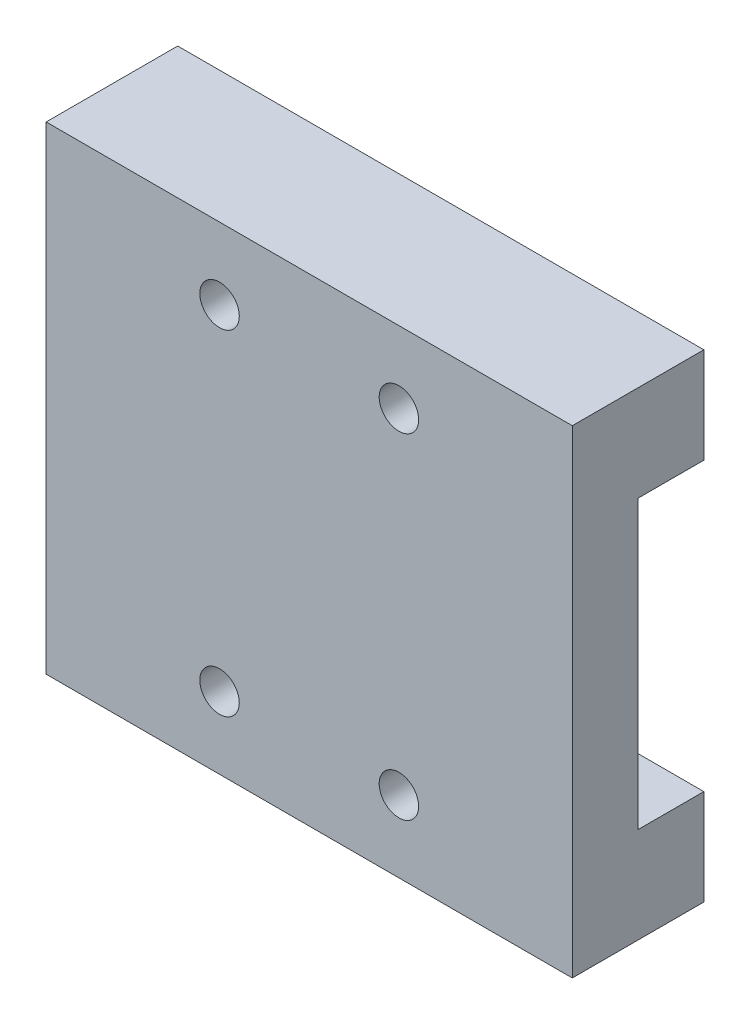
ISO-10303-21;
HEADER;
FILE_DESCRIPTION(('STEP AP214'),'2;1');
FILE_NAME('part.step','',(''),(''),'','','');
FILE_SCHEMA(('AUTOMOTIVE_DESIGN { 1 0 10303 214 1 1 1 1 }'));
ENDSEC;
DATA;
#1=APPLICATION_CONTEXT('core data for automotive mechanical design processes');
#2=APPLICATION_PROTOCOL_DEFINITION('international standard','automotive_design',2000,#1);
#3=PRODUCT_CONTEXT('',#1,'mechanical');
#4=PRODUCT('Part','Part','',(#3));
#5=PRODUCT_RELATED_PRODUCT_CATEGORY('part','',(#4));
#6=PRODUCT_DEFINITION_FORMATION('','',#4);
#7=PRODUCT_DEFINITION_CONTEXT('part definition',#1,'design');
#8=PRODUCT_DEFINITION('design','',#6,#7);
#9=PRODUCT_DEFINITION_SHAPE('','',#8);
#10=(LENGTH_UNIT() NAMED_UNIT(*) SI_UNIT(.MILLI.,.METRE.));
#11=(NAMED_UNIT(*) PLANE_ANGLE_UNIT() SI_UNIT($,.RADIAN.));
#12=(NAMED_UNIT(*) SI_UNIT($,.STERADIAN.) SOLID_ANGLE_UNIT());
#13=UNCERTAINTY_MEASURE_WITH_UNIT(LENGTH_MEASURE(1.E-05),#10,'distance_accuracy_value','');
#14=(GEOMETRIC_REPRESENTATION_CONTEXT(3) GLOBAL_UNCERTAINTY_ASSIGNED_CONTEXT((#13)) GLOBAL_UNIT_ASSIGNED_CONTEXT((#10,
#11,#12)) REPRESENTATION_CONTEXT('',''));
#15=CARTESIAN_POINT('',(0.,0.,0.));
#16=DIRECTION('',(0.,0.,1.));
#17=DIRECTION('',(1.,0.,0.));
#18=AXIS2_PLACEMENT_3D('',#15,#16,#17);
#19=CARTESIAN_POINT('',(0.,40.,0.));
#20=DIRECTION('',(0.,0.,-1.));
#21=DIRECTION('',(-1.,0.,0.));
#22=AXIS2_PLACEMENT_3D('',#19,#20,#21);
#23=PLANE('',#22);
#24=CARTESIAN_POINT('',(14.5,34.,0.));
#25=DIRECTION('',(0.,0.,-1.));
#26=DIRECTION('',(-1.,0.,0.));
#27=AXIS2_PLACEMENT_3D('',#24,#25,#26);
#28=CIRCLE('',#27,0.152148465884537);
#29=CARTESIAN_POINT('',(14.6521484658845,34.,0.));
#30=VERTEX_POINT('',#29);
#31=EDGE_CURVE('E39',#30,#30,#28,.T.);
#32=ORIENTED_EDGE('',*,*,#31,.F.);
#33=EDGE_LOOP('',(#32));
#34=FACE_BOUND('',#33,.T.);
#35=CARTESIAN_POINT('',(29.5,34.,0.));
#36=DIRECTION('',(0.,0.,-1.));
#37=DIRECTION('',(-1.,0.,0.));
#38=AXIS2_PLACEMENT_3D('',#35,#36,#37);
#39=CIRCLE('',#38,0.152148465884537);
#40=CARTESIAN_POINT('',(29.6521484658845,34.,0.));
#41=VERTEX_POINT('',#40);
#42=EDGE_CURVE('E176',#41,#41,#39,.T.);
#43=ORIENTED_EDGE('',*,*,#42,.F.);
#44=EDGE_LOOP('',(#43));
#45=FACE_BOUND('',#44,.T.);
#46=DIRECTION('',(-1.,0.,0.));
#47=VECTOR('',#46,1.);
#48=CARTESIAN_POINT('',(44.,32.,0.));
#49=LINE('',#48,#47);
#50=CARTESIAN_POINT('',(44.,32.,0.));
#51=VERTEX_POINT('',#50);
#52=CARTESIAN_POINT('',(0.,32.,0.));
#53=VERTEX_POINT('',#52);
#54=EDGE_CURVE('E145',#51,#53,#49,.T.);
#55=ORIENTED_EDGE('',*,*,#54,.T.);
#56=DIRECTION('',(0.,-1.,0.));
#57=VECTOR('',#56,1.);
#58=CARTESIAN_POINT('',(0.,0.,0.));
#59=LINE('',#58,#57);
#60=CARTESIAN_POINT('',(0.,40.,0.));
#61=VERTEX_POINT('',#60);
#62=EDGE_CURVE('E158',#61,#53,#59,.T.);
#63=ORIENTED_EDGE('',*,*,#62,.F.);
#64=DIRECTION('',(-1.,0.,0.));
#65=VECTOR('',#64,1.);
#66=CARTESIAN_POINT('',(0.,40.,0.));
#67=LINE('',#66,#65);
#68=CARTESIAN_POINT('',(44.,40.,0.));
#69=VERTEX_POINT('',#68);
#70=EDGE_CURVE('E82',#69,#61,#67,.T.);
#71=ORIENTED_EDGE('',*,*,#70,.F.);
#72=DIRECTION('',(0.,1.,0.));
#73=VECTOR('',#72,1.);
#74=CARTESIAN_POINT('',(44.,0.,0.));
#75=LINE('',#74,#73);
#76=EDGE_CURVE('E163',#51,#69,#75,.T.);
#77=ORIENTED_EDGE('',*,*,#76,.F.);
#78=EDGE_LOOP('',(#55,#63,#71,#77));
#79=FACE_BOUND('',#78,.T.);
#80=ADVANCED_FACE('F35',(#34,#45,#79),#23,.T.);
#81=CARTESIAN_POINT('',(0.,0.,11.));
#82=DIRECTION('',(1.,0.,0.));
#83=DIRECTION('',(0.,0.,-1.));
#84=AXIS2_PLACEMENT_3D('',#81,#82,#83);
#85=PLANE('',#84);
#86=ORIENTED_EDGE('',*,*,#62,.T.);
#87=DIRECTION('',(0.,0.,-1.));
#88=VECTOR('',#87,1.);
#89=CARTESIAN_POINT('',(0.,32.,0.));
#90=LINE('',#89,#88);
#91=CARTESIAN_POINT('',(0.,32.,5.5));
#92=VERTEX_POINT('',#91);
#93=EDGE_CURVE('E133',#92,#53,#90,.T.);
#94=ORIENTED_EDGE('',*,*,#93,.F.);
#95=DIRECTION('',(0.,1.,0.));
#96=VECTOR('',#95,1.);
#97=CARTESIAN_POINT('',(0.,8.,5.5));
#98=LINE('',#97,#96);
#99=CARTESIAN_POINT('',(0.,8.,5.5));
#100=VERTEX_POINT('',#99);
#101=EDGE_CURVE('E135',#100,#92,#98,.T.);
#102=ORIENTED_EDGE('',*,*,#101,.F.);
#103=DIRECTION('',(0.,0.,1.));
#104=VECTOR('',#103,1.);
#105=CARTESIAN_POINT('',(0.,8.,0.));
#106=LINE('',#105,#104);
#107=CARTESIAN_POINT('',(0.,8.,0.));
#108=VERTEX_POINT('',#107);
#109=EDGE_CURVE('E113',#108,#100,#106,.T.);
#110=ORIENTED_EDGE('',*,*,#109,.F.);
#111=CARTESIAN_POINT('',(0.,0.,0.));
#112=VERTEX_POINT('',#111);
#113=EDGE_CURVE('E148',#108,#112,#59,.T.);
#114=ORIENTED_EDGE('',*,*,#113,.T.);
#115=DIRECTION('',(0.,0.,-1.));
#116=VECTOR('',#115,1.);
#117=CARTESIAN_POINT('',(0.,0.,11.));
#118=LINE('',#117,#116);
#119=CARTESIAN_POINT('',(0.,0.,11.));
#120=VERTEX_POINT('',#119);
#121=EDGE_CURVE('E11',#120,#112,#118,.T.);
#122=ORIENTED_EDGE('',*,*,#121,.F.);
#123=DIRECTION('',(0.,-1.,0.));
#124=VECTOR('',#123,1.);
#125=CARTESIAN_POINT('',(0.,0.,11.));
#126=LINE('',#125,#124);
#127=CARTESIAN_POINT('',(0.,40.,11.));
#128=VERTEX_POINT('',#127);
#129=EDGE_CURVE('E151',#128,#120,#126,.T.);
#130=ORIENTED_EDGE('',*,*,#129,.F.);
#131=DIRECTION('',(0.,0.,-1.));
#132=VECTOR('',#131,1.);
#133=CARTESIAN_POINT('',(0.,40.,11.));
#134=LINE('',#133,#132);
#135=EDGE_CURVE('E157',#128,#61,#134,.T.);
#136=ORIENTED_EDGE('',*,*,#135,.T.);
#137=EDGE_LOOP('',(#86,#94,#102,#110,#114,#122,#130,#136));
#138=FACE_BOUND('',#137,.T.);
#139=ADVANCED_FACE('F37',(#138),#85,.F.);
#140=CARTESIAN_POINT('',(0.,0.,11.));
#141=DIRECTION('',(0.,1.,0.));
#142=DIRECTION('',(0.,0.,1.));
#143=AXIS2_PLACEMENT_3D('',#140,#141,#142);
#144=PLANE('',#143);
#145=DIRECTION('',(1.,0.,0.));
#146=VECTOR('',#145,1.);
#147=CARTESIAN_POINT('',(0.,0.,0.));
#148=LINE('',#147,#146);
#149=CARTESIAN_POINT('',(44.,0.,0.));
#150=VERTEX_POINT('',#149);
#151=EDGE_CURVE('E161',#112,#150,#148,.T.);
#152=ORIENTED_EDGE('',*,*,#151,.T.);
#153=DIRECTION('',(0.,0.,-1.));
#154=VECTOR('',#153,1.);
#155=CARTESIAN_POINT('',(44.,0.,11.));
#156=LINE('',#155,#154);
#157=CARTESIAN_POINT('',(44.,0.,11.));
#158=VERTEX_POINT('',#157);
#159=EDGE_CURVE('E44',#158,#150,#156,.T.);
#160=ORIENTED_EDGE('',*,*,#159,.F.);
#161=DIRECTION('',(1.,0.,0.));
#162=VECTOR('',#161,1.);
#163=CARTESIAN_POINT('',(0.,0.,11.));
#164=LINE('',#163,#162);
#165=EDGE_CURVE('E89',#120,#158,#164,.T.);
#166=ORIENTED_EDGE('',*,*,#165,.F.);
#167=ORIENTED_EDGE('',*,*,#121,.T.);
#168=EDGE_LOOP('',(#152,#160,#166,#167));
#169=FACE_BOUND('',#168,.T.);
#170=ADVANCED_FACE('F222',(#169),#144,.F.);
#171=CARTESIAN_POINT('',(44.,0.,11.));
#172=DIRECTION('',(-1.,0.,0.));
#173=DIRECTION('',(0.,0.,1.));
#174=AXIS2_PLACEMENT_3D('',#171,#172,#173);
#175=PLANE('',#174);
#176=DIRECTION('',(0.,1.,0.));
#177=VECTOR('',#176,1.);
#178=CARTESIAN_POINT('',(44.,8.,5.5));
#179=LINE('',#178,#177);
#180=CARTESIAN_POINT('',(44.,8.,5.5));
#181=VERTEX_POINT('',#180);
#182=CARTESIAN_POINT('',(44.,32.,5.5));
#183=VERTEX_POINT('',#182);
#184=EDGE_CURVE('E121',#181,#183,#179,.T.);
#185=ORIENTED_EDGE('',*,*,#184,.T.);
#186=DIRECTION('',(0.,0.,-1.));
#187=VECTOR('',#186,1.);
#188=CARTESIAN_POINT('',(44.,32.,0.));
#189=LINE('',#188,#187);
#190=EDGE_CURVE('E126',#183,#51,#189,.T.);
#191=ORIENTED_EDGE('',*,*,#190,.T.);
#192=ORIENTED_EDGE('',*,*,#76,.T.);
#193=DIRECTION('',(0.,0.,-1.));
#194=VECTOR('',#193,1.);
#195=CARTESIAN_POINT('',(44.,40.,11.));
#196=LINE('',#195,#194);
#197=CARTESIAN_POINT('',(44.,40.,11.));
#198=VERTEX_POINT('',#197);
#199=EDGE_CURVE('E167',#198,#69,#196,.T.);
#200=ORIENTED_EDGE('',*,*,#199,.F.);
#201=DIRECTION('',(0.,1.,0.));
#202=VECTOR('',#201,1.);
#203=CARTESIAN_POINT('',(44.,0.,11.));
#204=LINE('',#203,#202);
#205=EDGE_CURVE('E154',#158,#198,#204,.T.);
#206=ORIENTED_EDGE('',*,*,#205,.F.);
#207=ORIENTED_EDGE('',*,*,#159,.T.);
#208=CARTESIAN_POINT('',(44.,8.,0.));
#209=VERTEX_POINT('',#208);
#210=EDGE_CURVE('E132',#150,#209,#75,.T.);
#211=ORIENTED_EDGE('',*,*,#210,.T.);
#212=DIRECTION('',(0.,0.,1.));
#213=VECTOR('',#212,1.);
#214=CARTESIAN_POINT('',(44.,8.,0.));
#215=LINE('',#214,#213);
#216=EDGE_CURVE('E52',#209,#181,#215,.T.);
#217=ORIENTED_EDGE('',*,*,#216,.T.);
#218=EDGE_LOOP('',(#185,#191,#192,#200,#206,#207,#211,#217));
#219=FACE_BOUND('',#218,.T.);
#220=ADVANCED_FACE('F129',(#219),#175,.F.);
#221=CARTESIAN_POINT('',(0.,40.,11.));
#222=DIRECTION('',(0.,-1.,0.));
#223=DIRECTION('',(0.,0.,-1.));
#224=AXIS2_PLACEMENT_3D('',#221,#222,#223);
#225=PLANE('',#224);
#226=ORIENTED_EDGE('',*,*,#70,.T.);
#227=ORIENTED_EDGE('',*,*,#135,.F.);
#228=DIRECTION('',(-1.,0.,0.));
#229=VECTOR('',#228,1.);
#230=CARTESIAN_POINT('',(0.,40.,11.));
#231=LINE('',#230,#229);
#232=EDGE_CURVE('E61',#198,#128,#231,.T.);
#233=ORIENTED_EDGE('',*,*,#232,.F.);
#234=ORIENTED_EDGE('',*,*,#199,.T.);
#235=EDGE_LOOP('',(#226,#227,#233,#234));
#236=FACE_BOUND('',#235,.T.);
#237=ADVANCED_FACE('F238',(#236),#225,.F.);
#238=CARTESIAN_POINT('',(0.,40.,11.));
#239=DIRECTION('',(0.,0.,-1.));
#240=DIRECTION('',(-1.,0.,0.));
#241=AXIS2_PLACEMENT_3D('',#238,#239,#240);
#242=PLANE('',#241);
#243=CARTESIAN_POINT('',(14.5,34.,11.));
#244=DIRECTION('',(0.,0.,1.));
#245=DIRECTION('',(1.,0.,0.));
#246=AXIS2_PLACEMENT_3D('',#243,#244,#245);
#247=CIRCLE('',#246,1.64999999999999);
#248=CARTESIAN_POINT('',(16.15,34.,11.));
#249=VERTEX_POINT('',#248);
#250=EDGE_CURVE('E358',#249,#249,#247,.T.);
#251=ORIENTED_EDGE('',*,*,#250,.F.);
#252=EDGE_LOOP('',(#251));
#253=FACE_BOUND('',#252,.T.);
#254=CARTESIAN_POINT('',(29.5,34.,11.));
#255=DIRECTION('',(0.,0.,1.));
#256=DIRECTION('',(1.,0.,0.));
#257=AXIS2_PLACEMENT_3D('',#254,#255,#256);
#258=CIRCLE('',#257,1.64999999999999);
#259=CARTESIAN_POINT('',(31.15,34.,11.));
#260=VERTEX_POINT('',#259);
#261=EDGE_CURVE('E185',#260,#260,#258,.T.);
#262=ORIENTED_EDGE('',*,*,#261,.F.);
#263=EDGE_LOOP('',(#262));
#264=FACE_BOUND('',#263,.T.);
#265=CARTESIAN_POINT('',(14.5,6.,11.));
#266=DIRECTION('',(0.,0.,1.));
#267=DIRECTION('',(1.,0.,0.));
#268=AXIS2_PLACEMENT_3D('',#265,#266,#267);
#269=CIRCLE('',#268,1.64999999999999);
#270=CARTESIAN_POINT('',(16.15,6.,11.));
#271=VERTEX_POINT('',#270);
#272=EDGE_CURVE('E178',#271,#271,#269,.T.);
#273=ORIENTED_EDGE('',*,*,#272,.F.);
#274=EDGE_LOOP('',(#273));
#275=FACE_BOUND('',#274,.T.);
#276=CARTESIAN_POINT('',(29.5,5.99999999999999,11.));
#277=DIRECTION('',(0.,0.,1.));
#278=DIRECTION('',(1.,0.,0.));
#279=AXIS2_PLACEMENT_3D('',#276,#277,#278);
#280=CIRCLE('',#279,1.64999999999999);
#281=CARTESIAN_POINT('',(31.15,5.99999999999999,11.));
#282=VERTEX_POINT('',#281);
#283=EDGE_CURVE('E174',#282,#282,#280,.T.);
#284=ORIENTED_EDGE('',*,*,#283,.F.);
#285=EDGE_LOOP('',(#284));
#286=FACE_BOUND('',#285,.T.);
#287=ORIENTED_EDGE('',*,*,#129,.T.);
#288=ORIENTED_EDGE('',*,*,#165,.T.);
#289=ORIENTED_EDGE('',*,*,#205,.T.);
#290=ORIENTED_EDGE('',*,*,#232,.T.);
#291=EDGE_LOOP('',(#287,#288,#289,#290));
#292=FACE_BOUND('',#291,.T.);
#293=ADVANCED_FACE('F230',(#253,#264,#275,#286,#292),#242,.F.);
#294=CARTESIAN_POINT('',(14.5,6.,0.));
#295=DIRECTION('',(0.,0.,-1.));
#296=DIRECTION('',(-1.,0.,0.));
#297=AXIS2_PLACEMENT_3D('',#294,#295,#296);
#298=CIRCLE('',#297,0.152148465884537);
#299=CARTESIAN_POINT('',(14.6521484658845,6.,0.));
#300=VERTEX_POINT('',#299);
#301=EDGE_CURVE('E172',#300,#300,#298,.T.);
#302=ORIENTED_EDGE('',*,*,#301,.F.);
#303=EDGE_LOOP('',(#302));
#304=FACE_BOUND('',#303,.T.);
#305=CARTESIAN_POINT('',(29.5,5.99999999999999,0.));
#306=DIRECTION('',(0.,0.,-1.));
#307=DIRECTION('',(-1.,0.,0.));
#308=AXIS2_PLACEMENT_3D('',#305,#306,#307);
#309=CIRCLE('',#308,0.152148465884537);
#310=CARTESIAN_POINT('',(29.6521484658845,5.99999999999999,0.));
#311=VERTEX_POINT('',#310);
#312=EDGE_CURVE('E143',#311,#311,#309,.T.);
#313=ORIENTED_EDGE('',*,*,#312,.F.);
#314=EDGE_LOOP('',(#313));
#315=FACE_BOUND('',#314,.T.);
#316=DIRECTION('',(-1.,0.,0.));
#317=VECTOR('',#316,1.);
#318=CARTESIAN_POINT('',(44.,8.,0.));
#319=LINE('',#318,#317);
#320=EDGE_CURVE('E118',#209,#108,#319,.T.);
#321=ORIENTED_EDGE('',*,*,#320,.F.);
#322=ORIENTED_EDGE('',*,*,#210,.F.);
#323=ORIENTED_EDGE('',*,*,#151,.F.);
#324=ORIENTED_EDGE('',*,*,#113,.F.);
#325=EDGE_LOOP('',(#321,#322,#323,#324));
#326=FACE_BOUND('',#325,.T.);
#327=ADVANCED_FACE('F218',(#304,#315,#326),#23,.T.);
#328=CARTESIAN_POINT('',(44.,32.,0.));
#329=DIRECTION('',(0.,1.,0.));
#330=DIRECTION('',(0.,0.,1.));
#331=AXIS2_PLACEMENT_3D('',#328,#329,#330);
#332=PLANE('',#331);
#333=ORIENTED_EDGE('',*,*,#93,.T.);
#334=ORIENTED_EDGE('',*,*,#54,.F.);
#335=ORIENTED_EDGE('',*,*,#190,.F.);
#336=DIRECTION('',(-1.,0.,0.));
#337=VECTOR('',#336,1.);
#338=CARTESIAN_POINT('',(44.,32.,5.5));
#339=LINE('',#338,#337);
#340=EDGE_CURVE('E117',#183,#92,#339,.T.);
#341=ORIENTED_EDGE('',*,*,#340,.T.);
#342=EDGE_LOOP('',(#333,#334,#335,#341));
#343=FACE_BOUND('',#342,.T.);
#344=ADVANCED_FACE('F229',(#343),#332,.F.);
#345=CARTESIAN_POINT('',(44.,8.,5.5));
#346=DIRECTION('',(0.,0.,1.));
#347=DIRECTION('',(1.,0.,0.));
#348=AXIS2_PLACEMENT_3D('',#345,#346,#347);
#349=PLANE('',#348);
#350=ORIENTED_EDGE('',*,*,#101,.T.);
#351=ORIENTED_EDGE('',*,*,#340,.F.);
#352=ORIENTED_EDGE('',*,*,#184,.F.);
#353=DIRECTION('',(-1.,0.,0.));
#354=VECTOR('',#353,1.);
#355=CARTESIAN_POINT('',(44.,8.,5.5));
#356=LINE('',#355,#354);
#357=EDGE_CURVE('E109',#181,#100,#356,.T.);
#358=ORIENTED_EDGE('',*,*,#357,.T.);
#359=EDGE_LOOP('',(#350,#351,#352,#358));
#360=FACE_BOUND('',#359,.T.);
#361=ADVANCED_FACE('F122',(#360),#349,.F.);
#362=CARTESIAN_POINT('',(44.,8.,0.));
#363=DIRECTION('',(0.,-1.,0.));
#364=DIRECTION('',(0.,0.,-1.));
#365=AXIS2_PLACEMENT_3D('',#362,#363,#364);
#366=PLANE('',#365);
#367=ORIENTED_EDGE('',*,*,#109,.T.);
#368=ORIENTED_EDGE('',*,*,#357,.F.);
#369=ORIENTED_EDGE('',*,*,#216,.F.);
#370=ORIENTED_EDGE('',*,*,#320,.T.);
#371=EDGE_LOOP('',(#367,#368,#369,#370));
#372=FACE_BOUND('',#371,.T.);
#373=ADVANCED_FACE('F111',(#372),#366,.F.);
#374=CARTESIAN_POINT('',(29.5,5.99999999999999,0.900000000000001));
#375=DIRECTION('',(0.,0.,1.));
#376=DIRECTION('',(1.,0.,0.));
#377=AXIS2_PLACEMENT_3D('',#374,#375,#376);
#378=CONICAL_SURFACE('',#377,1.64999999999999,1.02974425867665);
#379=CARTESIAN_POINT('',(29.5,5.99999999999999,0.900000000000001));
#380=DIRECTION('',(0.,0.,1.));
#381=DIRECTION('',(1.,0.,0.));
#382=AXIS2_PLACEMENT_3D('',#379,#380,#381);
#383=CIRCLE('',#382,1.64999999999999);
#384=CARTESIAN_POINT('',(31.15,5.99999999999999,0.900000000000001));
#385=VERTEX_POINT('',#384);
#386=EDGE_CURVE('E138',#385,#385,#383,.T.);
#387=CARTESIAN_POINT('',(29.6521484658845,5.99999999999999,0.));
#388=CARTESIAN_POINT('',(29.6677510860316,5.99999999999999,0.00937499999999965));
#389=CARTESIAN_POINT('',(29.6833537061786,5.99999999999999,0.0187499999999997));
#390=CARTESIAN_POINT('',(29.7145589464727,5.99999999999999,0.0374999999999999));
#391=CARTESIAN_POINT('',(29.7301615666197,5.99999999999999,0.0468749999999999));
#392=CARTESIAN_POINT('',(29.7613668069138,5.99999999999999,0.0656250000000002));
#393=CARTESIAN_POINT('',(29.7769694270608,5.99999999999999,0.0750000000000005));
#394=CARTESIAN_POINT('',(29.8081746673549,5.99999999999999,0.0937500000000003));
#395=CARTESIAN_POINT('',(29.8237772875019,5.99999999999999,0.103125));
#396=CARTESIAN_POINT('',(29.854982527796,5.99999999999999,0.121875));
#397=CARTESIAN_POINT('',(29.870585147943,5.99999999999999,0.13125));
#398=CARTESIAN_POINT('',(29.9017903882371,5.99999999999999,0.15));
#399=CARTESIAN_POINT('',(29.9173930083842,5.99999999999999,0.159375000000001));
#400=CARTESIAN_POINT('',(29.9485982486782,5.99999999999999,0.178125));
#401=CARTESIAN_POINT('',(29.9642008688253,5.99999999999999,0.1875));
#402=CARTESIAN_POINT('',(29.9954061091193,5.99999999999999,0.20625));
#403=CARTESIAN_POINT('',(30.0110087292664,5.99999999999999,0.215625));
#404=CARTESIAN_POINT('',(30.0422139695604,5.99999999999999,0.234375000000001));
#405=CARTESIAN_POINT('',(30.0578165897075,5.99999999999999,0.243750000000001));
#406=CARTESIAN_POINT('',(30.0890218300015,5.99999999999999,0.262500000000001));
#407=CARTESIAN_POINT('',(30.1046244501486,5.99999999999999,0.271875));
#408=CARTESIAN_POINT('',(30.1358296904427,5.99999999999999,0.290625));
#409=CARTESIAN_POINT('',(30.1514323105897,5.99999999999999,0.3));
#410=CARTESIAN_POINT('',(30.1826375508838,5.99999999999999,0.318750000000001));
#411=CARTESIAN_POINT('',(30.1982401710308,5.99999999999999,0.328125000000001));
#412=CARTESIAN_POINT('',(30.2294454113249,5.99999999999999,0.346875000000001));
#413=CARTESIAN_POINT('',(30.2450480314719,5.99999999999999,0.35625));
#414=CARTESIAN_POINT('',(30.276253271766,5.99999999999999,0.375));
#415=CARTESIAN_POINT('',(30.291855891913,5.99999999999999,0.384375));
#416=CARTESIAN_POINT('',(30.3230611322071,5.99999999999999,0.403125000000001));
#417=CARTESIAN_POINT('',(30.3386637523541,5.99999999999999,0.412500000000001));
#418=CARTESIAN_POINT('',(30.3698689926482,5.99999999999999,0.431250000000001));
#419=CARTESIAN_POINT('',(30.3854716127952,5.99999999999999,0.440625000000001));
#420=CARTESIAN_POINT('',(30.4166768530893,5.99999999999999,0.459375));
#421=CARTESIAN_POINT('',(30.4322794732363,5.99999999999999,0.468750000000001));
#422=CARTESIAN_POINT('',(30.4634847135304,5.99999999999999,0.487500000000001));
#423=CARTESIAN_POINT('',(30.4790873336774,5.99999999999999,0.496875000000001));
#424=CARTESIAN_POINT('',(30.5102925739715,5.99999999999999,0.515625000000001));
#425=CARTESIAN_POINT('',(30.5258951941186,5.99999999999999,0.525000000000001));
#426=CARTESIAN_POINT('',(30.5571004344126,5.99999999999999,0.543750000000001));
#427=CARTESIAN_POINT('',(30.5727030545597,5.99999999999999,0.553125000000001));
#428=CARTESIAN_POINT('',(30.6039082948537,5.99999999999999,0.571875000000001));
#429=CARTESIAN_POINT('',(30.6195109150008,5.99999999999999,0.581250000000001));
#430=CARTESIAN_POINT('',(30.6507161552948,5.99999999999999,0.600000000000001));
#431=CARTESIAN_POINT('',(30.6663187754419,5.99999999999999,0.609375000000001));
#432=CARTESIAN_POINT('',(30.697524015736,5.99999999999999,0.628125000000001));
#433=CARTESIAN_POINT('',(30.713126635883,5.99999999999999,0.637500000000001));
#434=CARTESIAN_POINT('',(30.7443318761771,5.99999999999999,0.656250000000001));
#435=CARTESIAN_POINT('',(30.7599344963241,5.99999999999999,0.665625000000001));
#436=CARTESIAN_POINT('',(30.7911397366182,5.99999999999999,0.684375000000001));
#437=CARTESIAN_POINT('',(30.8067423567652,5.99999999999999,0.693750000000001));
#438=CARTESIAN_POINT('',(30.8379475970593,5.99999999999999,0.712500000000001));
#439=CARTESIAN_POINT('',(30.8535502172063,5.99999999999999,0.721875000000001));
#440=CARTESIAN_POINT('',(30.8847554575004,5.99999999999999,0.740625000000001));
#441=CARTESIAN_POINT('',(30.9003580776474,5.99999999999999,0.750000000000002));
#442=CARTESIAN_POINT('',(30.9315633179415,5.99999999999999,0.768750000000001));
#443=CARTESIAN_POINT('',(30.9471659380885,5.99999999999999,0.778125000000001));
#444=CARTESIAN_POINT('',(30.9783711783826,5.99999999999999,0.796875000000001));
#445=CARTESIAN_POINT('',(30.9939737985296,5.99999999999999,0.806250000000001));
#446=CARTESIAN_POINT('',(31.0251790388237,5.99999999999999,0.825000000000002));
#447=CARTESIAN_POINT('',(31.0407816589707,5.99999999999999,0.834375000000002));
#448=CARTESIAN_POINT('',(31.0719868992648,5.99999999999999,0.853125000000002));
#449=CARTESIAN_POINT('',(31.0875895194118,5.99999999999999,0.862500000000001));
#450=CARTESIAN_POINT('',(31.1187947597059,5.99999999999999,0.881250000000001));
#451=CARTESIAN_POINT('',(31.134397379853,5.99999999999999,0.890625000000001));
#452=CARTESIAN_POINT('',(31.15,5.99999999999999,0.900000000000001));
#453=B_SPLINE_CURVE_WITH_KNOTS('',3,(#387,#388,#389,#390,#391,#392,#393,#394,#395,#396,#397,
#398,#399,#400,#401,#402,#403,#404,#405,#406,#407,#408,#409,#410,#411,#412,#413,#414,#415,#416,
#417,#418,#419,#420,#421,#422,#423,#424,#425,#426,#427,#428,#429,#430,#431,#432,#433,#434,#435,
#436,#437,#438,#439,#440,#441,#442,#443,#444,#445,#446,#447,#448,#449,#450,#451,#452),
.UNSPECIFIED.,.F.,.F.,(4,2,2,2,2,2,2,2,2,2,2,2,2,2,2,2,2,2,2,2,2,2,2,2,2,2,2,2,2,2,2,2,4),(0.,
0.0546076132427928,0.109215226485583,0.163822839728373,0.218430452971165,0.273038066213955,
0.327645679456745,0.382253292699538,0.436860905942328,0.491468519185118,0.546076132427911,
0.6006837456707,0.65529135891349,0.709898972156283,0.764506585399073,0.819114198641863,
0.873721811884656,0.928329425127446,0.982937038370236,1.03754465161303,1.09215226485582,
1.14675987809861,1.2013674913414,1.25597510458419,1.31058271782698,1.36519033106977,
1.41979794431256,1.47440555755535,1.52901317079815,1.58362078404094,1.63822839728373,
1.69283601052652,1.74744362376931),.UNSPECIFIED.);
#454=EDGE_CURVE('BSEAM200',#311,#385,#453,.T.);
#455=ORIENTED_EDGE('',*,*,#312,.T.);
#456=ORIENTED_EDGE('',*,*,#386,.T.);
#457=ORIENTED_EDGE('',*,*,#454,.T.);
#458=ORIENTED_EDGE('',*,*,#454,.F.);
#459=EDGE_LOOP('',(#455,#457,#456,#458));
#460=FACE_BOUND('',#459,.T.);
#461=ADVANCED_FACE('F200',(#460),#378,.F.);
#462=CARTESIAN_POINT('',(29.5,5.99999999999999,11.));
#463=DIRECTION('',(0.,0.,1.));
#464=DIRECTION('',(1.,0.,0.));
#465=AXIS2_PLACEMENT_3D('',#462,#463,#464);
#466=CYLINDRICAL_SURFACE('',#465,1.64999999999999);
#467=ORIENTED_EDGE('',*,*,#386,.F.);
#468=EDGE_LOOP('',(#467));
#469=FACE_BOUND('',#468,.T.);
#470=ORIENTED_EDGE('',*,*,#283,.T.);
#471=EDGE_LOOP('',(#470));
#472=FACE_BOUND('',#471,.T.);
#473=ADVANCED_FACE('F202',(#469,#472),#466,.F.);
#474=CARTESIAN_POINT('',(14.5,6.,0.900000000000001));
#475=DIRECTION('',(0.,0.,1.));
#476=DIRECTION('',(1.,0.,0.));
#477=AXIS2_PLACEMENT_3D('',#474,#475,#476);
#478=CONICAL_SURFACE('',#477,1.64999999999999,1.02974425867665);
#479=CARTESIAN_POINT('',(14.5,6.,0.900000000000001));
#480=DIRECTION('',(0.,0.,1.));
#481=DIRECTION('',(1.,0.,0.));
#482=AXIS2_PLACEMENT_3D('',#479,#480,#481);
#483=CIRCLE('',#482,1.64999999999999);
#484=CARTESIAN_POINT('',(16.15,6.,0.900000000000001));
#485=VERTEX_POINT('',#484);
#486=EDGE_CURVE('E175',#485,#485,#483,.T.);
#487=CARTESIAN_POINT('',(14.6521484658845,6.,0.));
#488=CARTESIAN_POINT('',(14.6677510860316,6.,0.00937500000000018));
#489=CARTESIAN_POINT('',(14.6833537061786,6.,0.0187500000000001));
#490=CARTESIAN_POINT('',(14.7145589464727,6.,0.0375));
#491=CARTESIAN_POINT('',(14.7301615666197,6.,0.0468749999999999));
#492=CARTESIAN_POINT('',(14.7613668069138,6.,0.065625));
#493=CARTESIAN_POINT('',(14.7769694270608,6.,0.0750000000000002));
#494=CARTESIAN_POINT('',(14.8081746673549,6.,0.0937500000000003));
#495=CARTESIAN_POINT('',(14.8237772875019,6.,0.103125));
#496=CARTESIAN_POINT('',(14.854982527796,6.,0.121875));
#497=CARTESIAN_POINT('',(14.870585147943,6.,0.13125));
#498=CARTESIAN_POINT('',(14.9017903882371,6.,0.15));
#499=CARTESIAN_POINT('',(14.9173930083842,6.,0.159375));
#500=CARTESIAN_POINT('',(14.9485982486782,6.,0.178125));
#501=CARTESIAN_POINT('',(14.9642008688253,6.,0.1875));
#502=CARTESIAN_POINT('',(14.9954061091193,6.,0.20625));
#503=CARTESIAN_POINT('',(15.0110087292664,6.,0.215625));
#504=CARTESIAN_POINT('',(15.0422139695604,6.,0.234375));
#505=CARTESIAN_POINT('',(15.0578165897075,6.,0.24375));
#506=CARTESIAN_POINT('',(15.0890218300016,6.,0.262500000000001));
#507=CARTESIAN_POINT('',(15.1046244501486,6.,0.271875000000001));
#508=CARTESIAN_POINT('',(15.1358296904427,6.,0.290625));
#509=CARTESIAN_POINT('',(15.1514323105897,6.,0.3));
#510=CARTESIAN_POINT('',(15.1826375508838,6.,0.31875));
#511=CARTESIAN_POINT('',(15.1982401710308,6.,0.328125000000001));
#512=CARTESIAN_POINT('',(15.2294454113249,6.,0.346875000000001));
#513=CARTESIAN_POINT('',(15.2450480314719,6.,0.356250000000001));
#514=CARTESIAN_POINT('',(15.276253271766,6.,0.375000000000001));
#515=CARTESIAN_POINT('',(15.291855891913,6.,0.384375));
#516=CARTESIAN_POINT('',(15.3230611322071,6.,0.403125000000001));
#517=CARTESIAN_POINT('',(15.3386637523541,6.,0.412500000000001));
#518=CARTESIAN_POINT('',(15.3698689926482,6.,0.431250000000001));
#519=CARTESIAN_POINT('',(15.3854716127952,6.,0.440625000000001));
#520=CARTESIAN_POINT('',(15.4166768530893,6.,0.459375000000001));
#521=CARTESIAN_POINT('',(15.4322794732363,6.,0.468750000000001));
#522=CARTESIAN_POINT('',(15.4634847135304,6.,0.487500000000001));
#523=CARTESIAN_POINT('',(15.4790873336775,6.,0.496875000000001));
#524=CARTESIAN_POINT('',(15.5102925739715,6.,0.515625000000001));
#525=CARTESIAN_POINT('',(15.5258951941186,6.,0.525000000000001));
#526=CARTESIAN_POINT('',(15.5571004344126,6.,0.543750000000001));
#527=CARTESIAN_POINT('',(15.5727030545597,6.,0.553125000000001));
#528=CARTESIAN_POINT('',(15.6039082948537,6.,0.571875000000001));
#529=CARTESIAN_POINT('',(15.6195109150008,6.,0.581250000000001));
#530=CARTESIAN_POINT('',(15.6507161552948,6.,0.600000000000001));
#531=CARTESIAN_POINT('',(15.6663187754419,6.,0.609375000000001));
#532=CARTESIAN_POINT('',(15.697524015736,6.,0.628125000000001));
#533=CARTESIAN_POINT('',(15.713126635883,6.,0.637500000000001));
#534=CARTESIAN_POINT('',(15.7443318761771,6.,0.656250000000001));
#535=CARTESIAN_POINT('',(15.7599344963241,6.,0.665625000000001));
#536=CARTESIAN_POINT('',(15.7911397366182,6.,0.684375000000001));
#537=CARTESIAN_POINT('',(15.8067423567652,6.,0.693750000000001));
#538=CARTESIAN_POINT('',(15.8379475970593,6.,0.712500000000001));
#539=CARTESIAN_POINT('',(15.8535502172063,6.,0.721875000000001));
#540=CARTESIAN_POINT('',(15.8847554575004,6.,0.740625000000001));
#541=CARTESIAN_POINT('',(15.9003580776474,6.,0.750000000000002));
#542=CARTESIAN_POINT('',(15.9315633179415,6.,0.768750000000001));
#543=CARTESIAN_POINT('',(15.9471659380885,6.,0.778125000000001));
#544=CARTESIAN_POINT('',(15.9783711783826,6.,0.796875000000001));
#545=CARTESIAN_POINT('',(15.9939737985296,6.,0.806250000000001));
#546=CARTESIAN_POINT('',(16.0251790388237,6.,0.825000000000002));
#547=CARTESIAN_POINT('',(16.0407816589707,6.,0.834375000000002));
#548=CARTESIAN_POINT('',(16.0719868992648,6.,0.853125000000002));
#549=CARTESIAN_POINT('',(16.0875895194119,6.,0.862500000000001));
#550=CARTESIAN_POINT('',(16.1187947597059,6.,0.881250000000001));
#551=CARTESIAN_POINT('',(16.134397379853,6.,0.890625000000001));
#552=CARTESIAN_POINT('',(16.15,6.,0.900000000000001));
#553=B_SPLINE_CURVE_WITH_KNOTS('',3,(#487,#488,#489,#490,#491,#492,#493,#494,#495,#496,#497,
#498,#499,#500,#501,#502,#503,#504,#505,#506,#507,#508,#509,#510,#511,#512,#513,#514,#515,#516,
#517,#518,#519,#520,#521,#522,#523,#524,#525,#526,#527,#528,#529,#530,#531,#532,#533,#534,#535,
#536,#537,#538,#539,#540,#541,#542,#543,#544,#545,#546,#547,#548,#549,#550,#551,#552),
.UNSPECIFIED.,.F.,.F.,(4,2,2,2,2,2,2,2,2,2,2,2,2,2,2,2,2,2,2,2,2,2,2,2,2,2,2,2,2,2,2,2,4),(0.,
0.0546076132427914,0.109215226485583,0.163822839728373,0.218430452971164,0.273038066213955,
0.327645679456745,0.382253292699537,0.436860905942328,0.491468519185118,0.546076132427909,
0.6006837456707,0.65529135891349,0.709898972156282,0.764506585399073,0.819114198641863,
0.873721811884654,0.928329425127446,0.982937038370235,1.03754465161303,1.09215226485582,
1.14675987809861,1.2013674913414,1.25597510458419,1.31058271782698,1.36519033106977,
1.41979794431256,1.47440555755535,1.52901317079815,1.58362078404094,1.63822839728373,
1.69283601052652,1.74744362376931),.UNSPECIFIED.);
#554=EDGE_CURVE('BSEAM204',#300,#485,#553,.T.);
#555=ORIENTED_EDGE('',*,*,#301,.T.);
#556=ORIENTED_EDGE('',*,*,#486,.T.);
#557=ORIENTED_EDGE('',*,*,#554,.T.);
#558=ORIENTED_EDGE('',*,*,#554,.F.);
#559=EDGE_LOOP('',(#555,#557,#556,#558));
#560=FACE_BOUND('',#559,.T.);
#561=ADVANCED_FACE('F204',(#560),#478,.F.);
#562=CARTESIAN_POINT('',(14.5,6.,11.));
#563=DIRECTION('',(0.,0.,1.));
#564=DIRECTION('',(1.,0.,0.));
#565=AXIS2_PLACEMENT_3D('',#562,#563,#564);
#566=CYLINDRICAL_SURFACE('',#565,1.64999999999999);
#567=ORIENTED_EDGE('',*,*,#486,.F.);
#568=EDGE_LOOP('',(#567));
#569=FACE_BOUND('',#568,.T.);
#570=ORIENTED_EDGE('',*,*,#272,.T.);
#571=EDGE_LOOP('',(#570));
#572=FACE_BOUND('',#571,.T.);
#573=ADVANCED_FACE('F210',(#569,#572),#566,.F.);
#574=CARTESIAN_POINT('',(29.5,34.,0.900000000000001));
#575=DIRECTION('',(0.,0.,1.));
#576=DIRECTION('',(1.,0.,0.));
#577=AXIS2_PLACEMENT_3D('',#574,#575,#576);
#578=CONICAL_SURFACE('',#577,1.64999999999999,1.02974425867665);
#579=CARTESIAN_POINT('',(29.5,34.,0.900000000000001));
#580=DIRECTION('',(0.,0.,1.));
#581=DIRECTION('',(1.,0.,0.));
#582=AXIS2_PLACEMENT_3D('',#579,#580,#581);
#583=CIRCLE('',#582,1.64999999999999);
#584=CARTESIAN_POINT('',(31.15,34.,0.900000000000001));
#585=VERTEX_POINT('',#584);
#586=EDGE_CURVE('E179',#585,#585,#583,.T.);
#587=CARTESIAN_POINT('',(29.6521484658845,34.,0.));
#588=CARTESIAN_POINT('',(29.6677510860316,34.,0.00937499999999965));
#589=CARTESIAN_POINT('',(29.6833537061786,34.,0.0187499999999997));
#590=CARTESIAN_POINT('',(29.7145589464727,34.,0.0374999999999999));
#591=CARTESIAN_POINT('',(29.7301615666197,34.,0.0468749999999999));
#592=CARTESIAN_POINT('',(29.7613668069138,34.,0.0656250000000002));
#593=CARTESIAN_POINT('',(29.7769694270608,34.,0.0750000000000005));
#594=CARTESIAN_POINT('',(29.8081746673549,34.,0.0937500000000003));
#595=CARTESIAN_POINT('',(29.8237772875019,34.,0.103125));
#596=CARTESIAN_POINT('',(29.854982527796,34.,0.121875));
#597=CARTESIAN_POINT('',(29.870585147943,34.,0.13125));
#598=CARTESIAN_POINT('',(29.9017903882371,34.,0.15));
#599=CARTESIAN_POINT('',(29.9173930083841,34.,0.159375000000001));
#600=CARTESIAN_POINT('',(29.9485982486782,34.,0.178125));
#601=CARTESIAN_POINT('',(29.9642008688253,34.,0.1875));
#602=CARTESIAN_POINT('',(29.9954061091193,34.,0.20625));
#603=CARTESIAN_POINT('',(30.0110087292664,34.,0.215625));
#604=CARTESIAN_POINT('',(30.0422139695604,34.,0.234375000000001));
#605=CARTESIAN_POINT('',(30.0578165897075,34.,0.243750000000001));
#606=CARTESIAN_POINT('',(30.0890218300015,34.,0.262500000000001));
#607=CARTESIAN_POINT('',(30.1046244501486,34.,0.271875));
#608=CARTESIAN_POINT('',(30.1358296904427,34.,0.290625));
#609=CARTESIAN_POINT('',(30.1514323105897,34.,0.3));
#610=CARTESIAN_POINT('',(30.1826375508838,34.,0.318750000000001));
#611=CARTESIAN_POINT('',(30.1982401710308,34.,0.328125000000001));
#612=CARTESIAN_POINT('',(30.2294454113249,34.,0.346875000000001));
#613=CARTESIAN_POINT('',(30.2450480314719,34.,0.35625));
#614=CARTESIAN_POINT('',(30.276253271766,34.,0.375));
#615=CARTESIAN_POINT('',(30.291855891913,34.,0.384375));
#616=CARTESIAN_POINT('',(30.3230611322071,34.,0.403125000000001));
#617=CARTESIAN_POINT('',(30.3386637523541,34.,0.412500000000001));
#618=CARTESIAN_POINT('',(30.3698689926482,34.,0.431250000000001));
#619=CARTESIAN_POINT('',(30.3854716127952,34.,0.440625000000001));
#620=CARTESIAN_POINT('',(30.4166768530893,34.,0.459375));
#621=CARTESIAN_POINT('',(30.4322794732363,34.,0.468750000000001));
#622=CARTESIAN_POINT('',(30.4634847135304,34.,0.487500000000001));
#623=CARTESIAN_POINT('',(30.4790873336774,34.,0.496875000000001));
#624=CARTESIAN_POINT('',(30.5102925739715,34.,0.515625000000001));
#625=CARTESIAN_POINT('',(30.5258951941185,34.,0.525000000000001));
#626=CARTESIAN_POINT('',(30.5571004344126,34.,0.543750000000001));
#627=CARTESIAN_POINT('',(30.5727030545597,34.,0.553125000000001));
#628=CARTESIAN_POINT('',(30.6039082948537,34.,0.571875000000001));
#629=CARTESIAN_POINT('',(30.6195109150008,34.,0.581250000000001));
#630=CARTESIAN_POINT('',(30.6507161552948,34.,0.600000000000001));
#631=CARTESIAN_POINT('',(30.6663187754419,34.,0.609375000000001));
#632=CARTESIAN_POINT('',(30.6975240157359,34.,0.628125000000001));
#633=CARTESIAN_POINT('',(30.713126635883,34.,0.637500000000001));
#634=CARTESIAN_POINT('',(30.744331876177,34.,0.656250000000001));
#635=CARTESIAN_POINT('',(30.7599344963241,34.,0.665625000000001));
#636=CARTESIAN_POINT('',(30.7911397366182,34.,0.684375000000001));
#637=CARTESIAN_POINT('',(30.8067423567652,34.,0.693750000000001));
#638=CARTESIAN_POINT('',(30.8379475970593,34.,0.712500000000001));
#639=CARTESIAN_POINT('',(30.8535502172063,34.,0.721875000000001));
#640=CARTESIAN_POINT('',(30.8847554575004,34.,0.740625000000001));
#641=CARTESIAN_POINT('',(30.9003580776474,34.,0.750000000000002));
#642=CARTESIAN_POINT('',(30.9315633179415,34.,0.768750000000001));
#643=CARTESIAN_POINT('',(30.9471659380885,34.,0.778125000000001));
#644=CARTESIAN_POINT('',(30.9783711783826,34.,0.796875000000001));
#645=CARTESIAN_POINT('',(30.9939737985296,34.,0.806250000000001));
#646=CARTESIAN_POINT('',(31.0251790388237,34.,0.825000000000002));
#647=CARTESIAN_POINT('',(31.0407816589707,34.,0.834375000000002));
#648=CARTESIAN_POINT('',(31.0719868992648,34.,0.853125000000002));
#649=CARTESIAN_POINT('',(31.0875895194118,34.,0.862500000000001));
#650=CARTESIAN_POINT('',(31.1187947597059,34.,0.881250000000001));
#651=CARTESIAN_POINT('',(31.134397379853,34.,0.890625000000001));
#652=CARTESIAN_POINT('',(31.15,34.,0.900000000000001));
#653=B_SPLINE_CURVE_WITH_KNOTS('',3,(#587,#588,#589,#590,#591,#592,#593,#594,#595,#596,#597,
#598,#599,#600,#601,#602,#603,#604,#605,#606,#607,#608,#609,#610,#611,#612,#613,#614,#615,#616,
#617,#618,#619,#620,#621,#622,#623,#624,#625,#626,#627,#628,#629,#630,#631,#632,#633,#634,#635,
#636,#637,#638,#639,#640,#641,#642,#643,#644,#645,#646,#647,#648,#649,#650,#651,#652),
.UNSPECIFIED.,.F.,.F.,(4,2,2,2,2,2,2,2,2,2,2,2,2,2,2,2,2,2,2,2,2,2,2,2,2,2,2,2,2,2,2,2,4),(0.,
0.0546076132427928,0.109215226485583,0.163822839728373,0.218430452971165,0.273038066213955,
0.327645679456745,0.382253292699538,0.436860905942328,0.491468519185118,0.546076132427911,
0.6006837456707,0.65529135891349,0.709898972156283,0.764506585399073,0.819114198641863,
0.873721811884656,0.928329425127446,0.982937038370236,1.03754465161303,1.09215226485582,
1.14675987809861,1.2013674913414,1.25597510458419,1.31058271782698,1.36519033106977,
1.41979794431256,1.47440555755535,1.52901317079815,1.58362078404094,1.63822839728373,
1.69283601052652,1.74744362376931),.UNSPECIFIED.);
#654=EDGE_CURVE('BSEAM306',#41,#585,#653,.T.);
#655=ORIENTED_EDGE('',*,*,#42,.T.);
#656=ORIENTED_EDGE('',*,*,#586,.T.);
#657=ORIENTED_EDGE('',*,*,#654,.T.);
#658=ORIENTED_EDGE('',*,*,#654,.F.);
#659=EDGE_LOOP('',(#655,#657,#656,#658));
#660=FACE_BOUND('',#659,.T.);
#661=ADVANCED_FACE('F306',(#660),#578,.F.);
#662=CARTESIAN_POINT('',(29.5,34.,11.));
#663=DIRECTION('',(0.,0.,1.));
#664=DIRECTION('',(1.,0.,0.));
#665=AXIS2_PLACEMENT_3D('',#662,#663,#664);
#666=CYLINDRICAL_SURFACE('',#665,1.64999999999999);
#667=ORIENTED_EDGE('',*,*,#586,.F.);
#668=EDGE_LOOP('',(#667));
#669=FACE_BOUND('',#668,.T.);
#670=ORIENTED_EDGE('',*,*,#261,.T.);
#671=EDGE_LOOP('',(#670));
#672=FACE_BOUND('',#671,.T.);
#673=ADVANCED_FACE('F317',(#669,#672),#666,.F.);
#674=CARTESIAN_POINT('',(14.5,34.,0.900000000000001));
#675=DIRECTION('',(0.,0.,1.));
#676=DIRECTION('',(1.,0.,0.));
#677=AXIS2_PLACEMENT_3D('',#674,#675,#676);
#678=CONICAL_SURFACE('',#677,1.64999999999999,1.02974425867665);
#679=CARTESIAN_POINT('',(14.5,34.,0.900000000000001));
#680=DIRECTION('',(0.,0.,1.));
#681=DIRECTION('',(1.,0.,0.));
#682=AXIS2_PLACEMENT_3D('',#679,#680,#681);
#683=CIRCLE('',#682,1.64999999999999);
#684=CARTESIAN_POINT('',(16.15,34.,0.900000000000001));
#685=VERTEX_POINT('',#684);
#686=EDGE_CURVE('E355',#685,#685,#683,.T.);
#687=CARTESIAN_POINT('',(14.6521484658845,34.,0.));
#688=CARTESIAN_POINT('',(14.6677510860316,34.,0.00937500000000018));
#689=CARTESIAN_POINT('',(14.6833537061786,34.,0.0187500000000001));
#690=CARTESIAN_POINT('',(14.7145589464727,34.,0.0375));
#691=CARTESIAN_POINT('',(14.7301615666197,34.,0.0468749999999999));
#692=CARTESIAN_POINT('',(14.7613668069138,34.,0.065625));
#693=CARTESIAN_POINT('',(14.7769694270608,34.,0.0750000000000002));
#694=CARTESIAN_POINT('',(14.8081746673549,34.,0.0937500000000003));
#695=CARTESIAN_POINT('',(14.8237772875019,34.,0.103125));
#696=CARTESIAN_POINT('',(14.854982527796,34.,0.121875));
#697=CARTESIAN_POINT('',(14.870585147943,34.,0.13125));
#698=CARTESIAN_POINT('',(14.9017903882371,34.,0.15));
#699=CARTESIAN_POINT('',(14.9173930083842,34.,0.159375));
#700=CARTESIAN_POINT('',(14.9485982486782,34.,0.178125));
#701=CARTESIAN_POINT('',(14.9642008688253,34.,0.1875));
#702=CARTESIAN_POINT('',(14.9954061091193,34.,0.20625));
#703=CARTESIAN_POINT('',(15.0110087292664,34.,0.215625));
#704=CARTESIAN_POINT('',(15.0422139695604,34.,0.234375));
#705=CARTESIAN_POINT('',(15.0578165897075,34.,0.24375));
#706=CARTESIAN_POINT('',(15.0890218300015,34.,0.262500000000001));
#707=CARTESIAN_POINT('',(15.1046244501486,34.,0.271875000000001));
#708=CARTESIAN_POINT('',(15.1358296904427,34.,0.290625));
#709=CARTESIAN_POINT('',(15.1514323105897,34.,0.3));
#710=CARTESIAN_POINT('',(15.1826375508838,34.,0.31875));
#711=CARTESIAN_POINT('',(15.1982401710308,34.,0.328125000000001));
#712=CARTESIAN_POINT('',(15.2294454113249,34.,0.346875000000001));
#713=CARTESIAN_POINT('',(15.2450480314719,34.,0.356250000000001));
#714=CARTESIAN_POINT('',(15.276253271766,34.,0.375000000000001));
#715=CARTESIAN_POINT('',(15.291855891913,34.,0.384375));
#716=CARTESIAN_POINT('',(15.3230611322071,34.,0.403125000000001));
#717=CARTESIAN_POINT('',(15.3386637523541,34.,0.412500000000001));
#718=CARTESIAN_POINT('',(15.3698689926482,34.,0.431250000000001));
#719=CARTESIAN_POINT('',(15.3854716127952,34.,0.440625000000001));
#720=CARTESIAN_POINT('',(15.4166768530893,34.,0.459375000000001));
#721=CARTESIAN_POINT('',(15.4322794732363,34.,0.468750000000001));
#722=CARTESIAN_POINT('',(15.4634847135304,34.,0.487500000000001));
#723=CARTESIAN_POINT('',(15.4790873336774,34.,0.496875000000001));
#724=CARTESIAN_POINT('',(15.5102925739715,34.,0.515625000000001));
#725=CARTESIAN_POINT('',(15.5258951941186,34.,0.525000000000001));
#726=CARTESIAN_POINT('',(15.5571004344126,34.,0.543750000000001));
#727=CARTESIAN_POINT('',(15.5727030545597,34.,0.553125000000001));
#728=CARTESIAN_POINT('',(15.6039082948537,34.,0.571875000000001));
#729=CARTESIAN_POINT('',(15.6195109150008,34.,0.581250000000001));
#730=CARTESIAN_POINT('',(15.6507161552948,34.,0.600000000000001));
#731=CARTESIAN_POINT('',(15.6663187754419,34.,0.609375000000001));
#732=CARTESIAN_POINT('',(15.6975240157359,34.,0.628125000000001));
#733=CARTESIAN_POINT('',(15.713126635883,34.,0.637500000000001));
#734=CARTESIAN_POINT('',(15.7443318761771,34.,0.656250000000001));
#735=CARTESIAN_POINT('',(15.7599344963241,34.,0.665625000000001));
#736=CARTESIAN_POINT('',(15.7911397366182,34.,0.684375000000001));
#737=CARTESIAN_POINT('',(15.8067423567652,34.,0.693750000000001));
#738=CARTESIAN_POINT('',(15.8379475970593,34.,0.712500000000001));
#739=CARTESIAN_POINT('',(15.8535502172063,34.,0.721875000000001));
#740=CARTESIAN_POINT('',(15.8847554575004,34.,0.740625000000001));
#741=CARTESIAN_POINT('',(15.9003580776474,34.,0.750000000000002));
#742=CARTESIAN_POINT('',(15.9315633179415,34.,0.768750000000001));
#743=CARTESIAN_POINT('',(15.9471659380885,34.,0.778125000000001));
#744=CARTESIAN_POINT('',(15.9783711783826,34.,0.796875000000001));
#745=CARTESIAN_POINT('',(15.9939737985296,34.,0.806250000000001));
#746=CARTESIAN_POINT('',(16.0251790388237,34.,0.825000000000002));
#747=CARTESIAN_POINT('',(16.0407816589707,34.,0.834375000000002));
#748=CARTESIAN_POINT('',(16.0719868992648,34.,0.853125000000002));
#749=CARTESIAN_POINT('',(16.0875895194118,34.,0.862500000000001));
#750=CARTESIAN_POINT('',(16.1187947597059,34.,0.881250000000001));
#751=CARTESIAN_POINT('',(16.134397379853,34.,0.890625000000001));
#752=CARTESIAN_POINT('',(16.15,34.,0.900000000000001));
#753=B_SPLINE_CURVE_WITH_KNOTS('',3,(#687,#688,#689,#690,#691,#692,#693,#694,#695,#696,#697,
#698,#699,#700,#701,#702,#703,#704,#705,#706,#707,#708,#709,#710,#711,#712,#713,#714,#715,#716,
#717,#718,#719,#720,#721,#722,#723,#724,#725,#726,#727,#728,#729,#730,#731,#732,#733,#734,#735,
#736,#737,#738,#739,#740,#741,#742,#743,#744,#745,#746,#747,#748,#749,#750,#751,#752),
.UNSPECIFIED.,.F.,.F.,(4,2,2,2,2,2,2,2,2,2,2,2,2,2,2,2,2,2,2,2,2,2,2,2,2,2,2,2,2,2,2,2,4),(0.,
0.0546076132427914,0.109215226485583,0.163822839728373,0.218430452971164,0.273038066213955,
0.327645679456745,0.382253292699537,0.436860905942328,0.491468519185118,0.546076132427909,
0.6006837456707,0.65529135891349,0.709898972156282,0.764506585399073,0.819114198641863,
0.873721811884654,0.928329425127446,0.982937038370235,1.03754465161303,1.09215226485582,
1.14675987809861,1.2013674913414,1.25597510458419,1.31058271782698,1.36519033106977,
1.41979794431256,1.47440555755535,1.52901317079815,1.58362078404094,1.63822839728373,
1.69283601052652,1.74744362376931),.UNSPECIFIED.);
#754=EDGE_CURVE('BSEAM326',#30,#685,#753,.T.);
#755=ORIENTED_EDGE('',*,*,#31,.T.);
#756=ORIENTED_EDGE('',*,*,#686,.T.);
#757=ORIENTED_EDGE('',*,*,#754,.T.);
#758=ORIENTED_EDGE('',*,*,#754,.F.);
#759=EDGE_LOOP('',(#755,#757,#756,#758));
#760=FACE_BOUND('',#759,.T.);
#761=ADVANCED_FACE('F326',(#760),#678,.F.);
#762=CARTESIAN_POINT('',(14.5,34.,11.));
#763=DIRECTION('',(0.,0.,1.));
#764=DIRECTION('',(1.,0.,0.));
#765=AXIS2_PLACEMENT_3D('',#762,#763,#764);
#766=CYLINDRICAL_SURFACE('',#765,1.64999999999999);
#767=ORIENTED_EDGE('',*,*,#686,.F.);
#768=EDGE_LOOP('',(#767));
#769=FACE_BOUND('',#768,.T.);
#770=ORIENTED_EDGE('',*,*,#250,.T.);
#771=EDGE_LOOP('',(#770));
#772=FACE_BOUND('',#771,.T.);
#773=ADVANCED_FACE('F337',(#769,#772),#766,.F.);
#774=CLOSED_SHELL('',(#80,#139,#170,#220,#237,#293,#327,#344,#361,#373,#461,#473,#561,#573,#661,
#673,#761,#773));
#775=MANIFOLD_SOLID_BREP('B2',#774);
#776=ADVANCED_BREP_SHAPE_REPRESENTATION('',(#18,#775),#14);
#777=SHAPE_DEFINITION_REPRESENTATION(#9,#776);
ENDSEC;
END-ISO-10303-21;
